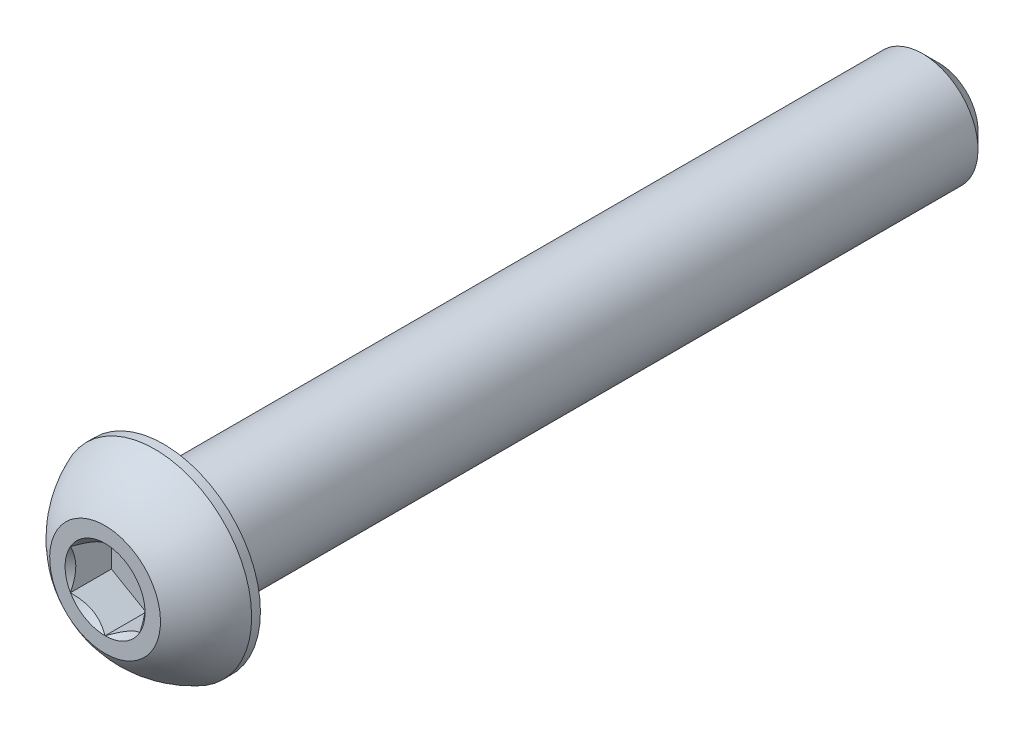
ISO-10303-21;
HEADER;
FILE_DESCRIPTION(('STEP AP214'),'2;1');
FILE_NAME('part.step','',(''),(''),'','','');
FILE_SCHEMA(('AUTOMOTIVE_DESIGN { 1 0 10303 214 1 1 1 1 }'));
ENDSEC;
DATA;
#1=APPLICATION_CONTEXT('core data for automotive mechanical design processes');
#2=APPLICATION_PROTOCOL_DEFINITION('international standard','automotive_design',2000,#1);
#3=PRODUCT_CONTEXT('',#1,'mechanical');
#4=PRODUCT('Part','Part','',(#3));
#5=PRODUCT_RELATED_PRODUCT_CATEGORY('part','',(#4));
#6=PRODUCT_DEFINITION_FORMATION('','',#4);
#7=PRODUCT_DEFINITION_CONTEXT('part definition',#1,'design');
#8=PRODUCT_DEFINITION('design','',#6,#7);
#9=PRODUCT_DEFINITION_SHAPE('','',#8);
#10=(LENGTH_UNIT() NAMED_UNIT(*) SI_UNIT(.MILLI.,.METRE.));
#11=(NAMED_UNIT(*) PLANE_ANGLE_UNIT() SI_UNIT($,.RADIAN.));
#12=(NAMED_UNIT(*) SI_UNIT($,.STERADIAN.) SOLID_ANGLE_UNIT());
#13=UNCERTAINTY_MEASURE_WITH_UNIT(LENGTH_MEASURE(1.E-05),#10,'distance_accuracy_value','');
#14=(GEOMETRIC_REPRESENTATION_CONTEXT(3) GLOBAL_UNCERTAINTY_ASSIGNED_CONTEXT((#13)) GLOBAL_UNIT_ASSIGNED_CONTEXT((#10,
#11,#12)) REPRESENTATION_CONTEXT('',''));
#15=CARTESIAN_POINT('',(0.,0.,0.));
#16=DIRECTION('',(0.,0.,1.));
#17=DIRECTION('',(1.,0.,0.));
#18=AXIS2_PLACEMENT_3D('',#15,#16,#17);
#19=CARTESIAN_POINT('',(-1.66533453693773E-13,-3.17499999999982,-47.8027999999999));
#20=DIRECTION('',(0.,0.,-1.));
#21=DIRECTION('',(0.,0.999999999999999,0.));
#22=AXIS2_PLACEMENT_3D('',#19,#20,#21);
#23=PLANE('',#22);
#24=CARTESIAN_POINT('',(-2.77555756156289E-13,2.22044604925031E-13,-47.8027999999999));
#25=DIRECTION('',(0.,0.,-1.));
#26=DIRECTION('',(0.,0.999999999999999,0.));
#27=AXIS2_PLACEMENT_3D('',#24,#25,#26);
#28=CIRCLE('',#27,2.22250000000001);
#29=CARTESIAN_POINT('',(-2.77575033270916E-13,2.22250000000023,-47.8027999999999));
#30=VERTEX_POINT('',#29);
#31=EDGE_CURVE('E180',#30,#30,#28,.T.);
#32=ORIENTED_EDGE('',*,*,#31,.T.);
#33=EDGE_LOOP('',(#32));
#34=FACE_BOUND('',#33,.T.);
#35=ADVANCED_FACE('F40',(#34),#23,.T.);
#36=CARTESIAN_POINT('',(-2.77555756156289E-13,2.22044604925031E-13,-47.8027999999999));
#37=DIRECTION('',(0.,0.,-1.));
#38=DIRECTION('',(0.,0.999999999999999,0.));
#39=AXIS2_PLACEMENT_3D('',#36,#37,#38);
#40=CYLINDRICAL_SURFACE('',#39,3.175);
#41=CARTESIAN_POINT('',(-2.77555756156289E-13,1.11022302462516E-13,-46.8503));
#42=DIRECTION('',(0.,0.,-1.));
#43=DIRECTION('',(0.,0.999999999999999,0.));
#44=AXIS2_PLACEMENT_3D('',#41,#42,#43);
#45=CIRCLE('',#44,3.175);
#46=CARTESIAN_POINT('',(-2.77581672713979E-13,3.17500000000022,-46.8503));
#47=VERTEX_POINT('',#46);
#48=EDGE_CURVE('E54',#47,#47,#45,.F.);
#49=CARTESIAN_POINT('',(-1.66533453693773E-13,1.11022302462516E-13,-3.35279999999999));
#50=DIRECTION('',(0.,0.,1.));
#51=DIRECTION('',(1.,0.,0.));
#52=AXIS2_PLACEMENT_3D('',#49,#50,#51);
#53=CIRCLE('',#52,3.175);
#54=CARTESIAN_POINT('',(-2.77507593275197E-13,3.17500000000022,-3.35279999999998));
#55=VERTEX_POINT('',#54);
#56=EDGE_CURVE('E177',#55,#55,#53,.F.);
#57=CARTESIAN_POINT('',(-2.77581672713979E-13,3.17500000000022,-46.8503));
#58=CARTESIAN_POINT('',(-2.77580901053158E-13,3.17500000000022,-46.3972010416666));
#59=CARTESIAN_POINT('',(-2.77580129392337E-13,3.17500000000022,-45.9441020833333));
#60=CARTESIAN_POINT('',(-2.77578586070696E-13,3.17500000000022,-45.0379041666666));
#61=CARTESIAN_POINT('',(-2.77577814409875E-13,3.17500000000022,-44.5848052083333));
#62=CARTESIAN_POINT('',(-2.77576271088234E-13,3.17500000000022,-43.6786072916666));
#63=CARTESIAN_POINT('',(-2.77575499427414E-13,3.17500000000022,-43.2255083333333));
#64=CARTESIAN_POINT('',(-2.77573956105772E-13,3.17500000000022,-42.3193104166666));
#65=CARTESIAN_POINT('',(-2.77573184444952E-13,3.17500000000022,-41.8662114583333));
#66=CARTESIAN_POINT('',(-2.7757164112331E-13,3.17500000000022,-40.9600135416666));
#67=CARTESIAN_POINT('',(-2.7757086946249E-13,3.17500000000022,-40.5069145833333));
#68=CARTESIAN_POINT('',(-2.77569326140848E-13,3.17500000000022,-39.6007166666666));
#69=CARTESIAN_POINT('',(-2.77568554480028E-13,3.17500000000022,-39.1476177083333));
#70=CARTESIAN_POINT('',(-2.77567011158386E-13,3.17500000000022,-38.2414197916666));
#71=CARTESIAN_POINT('',(-2.77566239497566E-13,3.17500000000022,-37.7883208333333));
#72=CARTESIAN_POINT('',(-2.77564696175925E-13,3.17500000000022,-36.8821229166666));
#73=CARTESIAN_POINT('',(-2.77563924515104E-13,3.17500000000022,-36.4290239583333));
#74=CARTESIAN_POINT('',(-2.77562381193463E-13,3.17500000000022,-35.5228260416666));
#75=CARTESIAN_POINT('',(-2.77561609532642E-13,3.17500000000022,-35.0697270833333));
#76=CARTESIAN_POINT('',(-2.77560066211001E-13,3.17500000000022,-34.1635291666666));
#77=CARTESIAN_POINT('',(-2.7755929455018E-13,3.17500000000022,-33.7104302083333));
#78=CARTESIAN_POINT('',(-2.77557751228539E-13,3.17500000000022,-32.8042322916666));
#79=CARTESIAN_POINT('',(-2.77556979567718E-13,3.17500000000022,-32.3511333333333));
#80=CARTESIAN_POINT('',(-2.77555436246077E-13,3.17500000000022,-31.4449354166666));
#81=CARTESIAN_POINT('',(-2.77554664585256E-13,3.17500000000022,-30.9918364583333));
#82=CARTESIAN_POINT('',(-2.77553121263615E-13,3.17500000000022,-30.0856385416666));
#83=CARTESIAN_POINT('',(-2.77552349602794E-13,3.17500000000022,-29.6325395833333));
#84=CARTESIAN_POINT('',(-2.77550806281153E-13,3.17500000000022,-28.7263416666666));
#85=CARTESIAN_POINT('',(-2.77550034620332E-13,3.17500000000022,-28.2732427083333));
#86=CARTESIAN_POINT('',(-2.77548491298691E-13,3.17500000000022,-27.3670447916666));
#87=CARTESIAN_POINT('',(-2.7754771963787E-13,3.17500000000022,-26.9139458333333));
#88=CARTESIAN_POINT('',(-2.77546176316229E-13,3.17500000000022,-26.0077479166666));
#89=CARTESIAN_POINT('',(-2.77545404655408E-13,3.17500000000022,-25.5546489583333));
#90=CARTESIAN_POINT('',(-2.77543861333767E-13,3.17500000000022,-24.6484510416666));
#91=CARTESIAN_POINT('',(-2.77543089672946E-13,3.17500000000022,-24.1953520833333));
#92=CARTESIAN_POINT('',(-2.77541546351305E-13,3.17500000000022,-23.2891541666666));
#93=CARTESIAN_POINT('',(-2.77540774690484E-13,3.17500000000022,-22.8360552083333));
#94=CARTESIAN_POINT('',(-2.77539231368843E-13,3.17500000000022,-21.9298572916666));
#95=CARTESIAN_POINT('',(-2.77538459708023E-13,3.17500000000022,-21.4767583333333));
#96=CARTESIAN_POINT('',(-2.77536916386381E-13,3.17500000000022,-20.5705604166666));
#97=CARTESIAN_POINT('',(-2.77536144725561E-13,3.17500000000022,-20.1174614583333));
#98=CARTESIAN_POINT('',(-2.77534601403919E-13,3.17500000000022,-19.2112635416666));
#99=CARTESIAN_POINT('',(-2.77533829743099E-13,3.17500000000022,-18.7581645833333));
#100=CARTESIAN_POINT('',(-2.77532286421457E-13,3.17500000000022,-17.8519666666666));
#101=CARTESIAN_POINT('',(-2.77531514760637E-13,3.17500000000022,-17.3988677083333));
#102=CARTESIAN_POINT('',(-2.77529971438995E-13,3.17500000000022,-16.4926697916666));
#103=CARTESIAN_POINT('',(-2.77529199778175E-13,3.17500000000022,-16.0395708333333));
#104=CARTESIAN_POINT('',(-2.77527656456533E-13,3.17500000000022,-15.1333729166666));
#105=CARTESIAN_POINT('',(-2.77526884795713E-13,3.17500000000022,-14.6802739583333));
#106=CARTESIAN_POINT('',(-2.77525341474071E-13,3.17500000000022,-13.7740760416666));
#107=CARTESIAN_POINT('',(-2.77524569813251E-13,3.17500000000022,-13.3209770833333));
#108=CARTESIAN_POINT('',(-2.7752302649161E-13,3.17500000000022,-12.4147791666666));
#109=CARTESIAN_POINT('',(-2.77522254830789E-13,3.17500000000022,-11.9616802083333));
#110=CARTESIAN_POINT('',(-2.77520711509148E-13,3.17500000000022,-11.0554822916666));
#111=CARTESIAN_POINT('',(-2.77519939848327E-13,3.17500000000022,-10.6023833333333));
#112=CARTESIAN_POINT('',(-2.77518396526686E-13,3.17500000000022,-9.69618541666664));
#113=CARTESIAN_POINT('',(-2.77517624865865E-13,3.17500000000022,-9.24308645833331));
#114=CARTESIAN_POINT('',(-2.77516081544224E-13,3.17500000000022,-8.33688854166664));
#115=CARTESIAN_POINT('',(-2.77515309883403E-13,3.17500000000022,-7.88378958333331));
#116=CARTESIAN_POINT('',(-2.77513766561762E-13,3.17500000000022,-6.97759166666665));
#117=CARTESIAN_POINT('',(-2.77512994900941E-13,3.17500000000022,-6.52449270833331));
#118=CARTESIAN_POINT('',(-2.775114515793E-13,3.17500000000022,-5.61829479166665));
#119=CARTESIAN_POINT('',(-2.77510679918479E-13,3.17500000000022,-5.16519583333332));
#120=CARTESIAN_POINT('',(-2.77509136596838E-13,3.17500000000022,-4.25899791666665));
#121=CARTESIAN_POINT('',(-2.77508364936017E-13,3.17500000000022,-3.80589895833331));
#122=CARTESIAN_POINT('',(-2.77507593275197E-13,3.17500000000022,-3.35279999999998));
#123=B_SPLINE_CURVE_WITH_KNOTS('',3,(#57,#58,#59,#60,#61,#62,#63,#64,#65,#66,#67,#68,#69,#70,
#71,#72,#73,#74,#75,#76,#77,#78,#79,#80,#81,#82,#83,#84,#85,#86,#87,#88,#89,#90,#91,#92,#93,#94,
#95,#96,#97,#98,#99,#100,#101,#102,#103,#104,#105,#106,#107,#108,#109,#110,#111,#112,#113,#114,
#115,#116,#117,#118,#119,#120,#121,#122),.UNSPECIFIED.,.F.,.F.,(4,2,2,2,2,2,2,2,2,2,2,2,2,2,2,2,
2,2,2,2,2,2,2,2,2,2,2,2,2,2,2,2,4),(0.,1.359296875,2.71859375,4.077890625,5.4371875,6.796484375,
8.15578124999999,9.51507812499999,10.874375,12.233671875,13.59296875,14.952265625,16.3115625,
17.670859375,19.03015625,20.389453125,21.74875,23.108046875,24.46734375,25.826640625,27.1859375,
28.545234375,29.90453125,31.263828125,32.623125,33.982421875,35.34171875,36.701015625,
38.0603125,39.419609375,40.77890625,42.138203125,43.4975),.UNSPECIFIED.);
#124=EDGE_CURVE('BSEAM185',#47,#55,#123,.T.);
#125=ORIENTED_EDGE('',*,*,#48,.T.);
#126=ORIENTED_EDGE('',*,*,#56,.T.);
#127=ORIENTED_EDGE('',*,*,#124,.T.);
#128=ORIENTED_EDGE('',*,*,#124,.F.);
#129=EDGE_LOOP('',(#125,#127,#126,#128));
#130=FACE_BOUND('',#129,.T.);
#131=ADVANCED_FACE('F185',(#130),#40,.T.);
#132=CARTESIAN_POINT('',(-2.77555756156289E-13,2.22044604925031E-13,-47.8027999999999));
#133=DIRECTION('',(0.,0.,1.));
#134=DIRECTION('',(0.,-0.999999999999999,0.));
#135=AXIS2_PLACEMENT_3D('',#132,#133,#134);
#136=CONICAL_SURFACE('',#135,2.22250000000001,0.785398163397447);
#137=ORIENTED_EDGE('',*,*,#48,.F.);
#138=EDGE_LOOP('',(#137));
#139=FACE_BOUND('',#138,.T.);
#140=ORIENTED_EDGE('',*,*,#31,.F.);
#141=EDGE_LOOP('',(#140));
#142=FACE_BOUND('',#141,.T.);
#143=ADVANCED_FACE('F42',(#139,#142),#136,.T.);
#144=CARTESIAN_POINT('',(0.,2.22044604925031E-13,-5.06031499999979));
#145=DIRECTION('',(0.,0.,1.));
#146=DIRECTION('',(0.,-0.999999999999999,0.));
#147=AXIS2_PLACEMENT_3D('',#144,#145,#146);
#148=SPHERICAL_SURFACE('',#147,5.97389428256184);
#149=CARTESIAN_POINT('',(0.,0.,0.));
#150=DIRECTION('',(0.,0.,1.));
#151=DIRECTION('',(1.,0.,0.));
#152=AXIS2_PLACEMENT_3D('',#149,#150,#151);
#153=CIRCLE('',#152,3.175);
#154=CARTESIAN_POINT('',(0.,-3.17500000000011,0.));
#155=VERTEX_POINT('',#154);
#156=EDGE_CURVE('E174',#155,#155,#153,.T.);
#157=CARTESIAN_POINT('',(-2.77555756156289E-13,1.11022302462516E-13,-2.84988));
#158=DIRECTION('',(0.,0.,1.));
#159=DIRECTION('',(1.,0.,0.));
#160=AXIS2_PLACEMENT_3D('',#157,#158,#159);
#161=CIRCLE('',#160,5.5499);
#162=CARTESIAN_POINT('',(0.,-5.54989999999986,-2.84988));
#163=VERTEX_POINT('',#162);
#164=EDGE_CURVE('E168',#163,#163,#161,.T.);
#165=CARTESIAN_POINT('',(0.,-3.17500000000011,0.));
#166=CARTESIAN_POINT('',(0.,-3.20828343957195,-0.0208830076580501));
#167=CARTESIAN_POINT('',(0.,-3.24136078860715,-0.0420944789280511));
#168=CARTESIAN_POINT('',(0.,-3.3070905577515,-0.0851658910984746));
#169=CARTESIAN_POINT('',(0.,-3.33974297786066,-0.107025831998897));
#170=CARTESIAN_POINT('',(0.,-3.40461014130017,-0.151385725836683));
#171=CARTESIAN_POINT('',(0.,-3.43682488463052,-0.173885678774046));
#172=CARTESIAN_POINT('',(0.,-3.50080416139469,-0.219516822259489));
#173=CARTESIAN_POINT('',(0.,-3.53256869482851,-0.242648012807569));
#174=CARTESIAN_POINT('',(0.,-3.59563518208841,-0.289532629449115));
#175=CARTESIAN_POINT('',(0.,-3.62693713591449,-0.313286055542582));
#176=CARTESIAN_POINT('',(0.,-3.68906627753113,-0.361405894091345));
#177=CARTESIAN_POINT('',(0.,-3.71989346532169,-0.385772306546641));
#178=CARTESIAN_POINT('',(0.,-3.7810610724321,-0.435108631276894));
#179=CARTESIAN_POINT('',(0.,-3.81140149175195,-0.46007854355185));
#180=CARTESIAN_POINT('',(0.,-3.87158374923264,-0.510612146063956));
#181=CARTESIAN_POINT('',(0.,-3.90142558739347,-0.536175836301106));
#182=CARTESIAN_POINT('',(0.,-3.96059906392417,-0.587887041792104));
#183=CARTESIAN_POINT('',(0.,-3.98993070229403,-0.614034557045953));
#184=CARTESIAN_POINT('',(0.,-4.04807235926835,-0.666903232293429));
#185=CARTESIAN_POINT('',(0.,-4.07688237787282,-0.693624392287057));
#186=CARTESIAN_POINT('',(0.,-4.13396957842493,-0.74762995340108));
#187=CARTESIAN_POINT('',(0.,-4.16224676037258,-0.774914354521477));
#188=CARTESIAN_POINT('',(0.,-4.21825727817543,-0.830035774981971));
#189=CARTESIAN_POINT('',(0.,-4.24599061403062,-0.857872794322069));
#190=CARTESIAN_POINT('',(0.,-4.30090264195358,-0.914088613159046));
#191=CARTESIAN_POINT('',(0.,-4.32808133402134,-0.942467412655924));
#192=CARTESIAN_POINT('',(0.,-4.38187349261952,-0.999755742806767));
#193=CARTESIAN_POINT('',(0.,-4.40848695914994,-1.02866527346073));
#194=CARTESIAN_POINT('',(0.,-4.46113830498837,-1.08700381029125));
#195=CARTESIAN_POINT('',(0.,-4.48717618429637,-1.11643281646781));
#196=CARTESIAN_POINT('',(0.,-4.538666218104,-1.17579884645646));
#197=CARTESIAN_POINT('',(0.,-4.56411837260362,-1.20573587026855));
#198=CARTESIAN_POINT('',(0.,-4.61442704725454,-1.26610627984967));
#199=CARTESIAN_POINT('',(0.,-4.63928356740584,-1.29653966561869));
#200=CARTESIAN_POINT('',(0.,-4.68839129572445,-1.35789095018152));
#201=CARTESIAN_POINT('',(0.,-4.71264250389174,-1.38880884897534));
#202=CARTESIAN_POINT('',(0.,-4.76053016627877,-1.45111712201536));
#203=CARTESIAN_POINT('',(0.,-4.78416662049849,-1.48250749626158));
#204=CARTESIAN_POINT('',(0.,-4.83081557237505,-1.54574849868044));
#205=CARTESIAN_POINT('',(0.,-4.85382807003188,-1.57759912685309));
#206=CARTESIAN_POINT('',(0.,-4.89922014909853,-1.64174823640365));
#207=CARTESIAN_POINT('',(0.,-4.92159973050835,-1.67404671778156));
#208=CARTESIAN_POINT('',(0.,-4.96571726381651,-1.73907895865429));
#209=CARTESIAN_POINT('',(0.,-4.98745521571486,-1.77181271814911));
#210=CARTESIAN_POINT('',(0.,-5.03028102654712,-1.83770277069634));
#211=CARTESIAN_POINT('',(0.,-5.05136888548103,-1.87085906374876));
#212=CARTESIAN_POINT('',(0.,-5.09288630004055,-1.93758127434191));
#213=CARTESIAN_POINT('',(0.,-5.11331585566616,-1.97114719188263));
#214=CARTESIAN_POINT('',(0.,-5.15350870956159,-2.03867558290301));
#215=CARTESIAN_POINT('',(0.,-5.17327200783142,-2.07263805638267));
#216=CARTESIAN_POINT('',(0.,-5.21212465239599,-2.14094633632488));
#217=CARTESIAN_POINT('',(0.,-5.23121399869072,-2.17529214278743));
#218=CARTESIAN_POINT('',(0.,-5.26871130697925,-2.24435371653591));
#219=CARTESIAN_POINT('',(0.,-5.28711926897304,-2.27906948382185));
#220=CARTESIAN_POINT('',(0.,-5.32324664200816,-2.34885746285521));
#221=CARTESIAN_POINT('',(0.,-5.34096605304949,-2.38392967460263));
#222=CARTESIAN_POINT('',(0.,-5.37570942417463,-2.45441688802314));
#223=CARTESIAN_POINT('',(0.,-5.39273338425844,-2.48983188969623));
#224=CARTESIAN_POINT('',(0.,-5.42607922958172,-2.56099089271575));
#225=CARTESIAN_POINT('',(0.,-5.44240111482119,-2.59673489406218));
#226=CARTESIAN_POINT('',(0.,-5.47433643994303,-2.66853798649801));
#227=CARTESIAN_POINT('',(0.,-5.4899498798254,-2.70459707758743));
#228=CARTESIAN_POINT('',(0.,-5.52046229408174,-2.77701628549785));
#229=CARTESIAN_POINT('',(0.,-5.53536126845572,-2.81337640231887));
#230=CARTESIAN_POINT('',(0.,-5.54989999999986,-2.84988));
#231=B_SPLINE_CURVE_WITH_KNOTS('',3,(#165,#166,#167,#168,#169,#170,#171,#172,#173,#174,#175,
#176,#177,#178,#179,#180,#181,#182,#183,#184,#185,#186,#187,#188,#189,#190,#191,#192,#193,#194,
#195,#196,#197,#198,#199,#200,#201,#202,#203,#204,#205,#206,#207,#208,#209,#210,#211,#212,#213,
#214,#215,#216,#217,#218,#219,#220,#221,#222,#223,#224,#225,#226,#227,#228,#229,#230),
.UNSPECIFIED.,.F.,.F.,(4,2,2,2,2,2,2,2,2,2,2,2,2,2,2,2,2,2,2,2,2,2,2,2,2,2,2,2,2,2,2,2,4),(0.,
0.117875080753694,0.235750161507388,0.353625242261083,0.471500323014778,0.589375403768472,
0.707250484522166,0.82512556527586,0.943000646029554,1.06087572678325,1.17875080753694,
1.29662588829064,1.41450096904433,1.53237604979803,1.65025113055172,1.76812621130541,
1.88600129205911,2.0038763728128,2.1217514535665,2.23962653432019,2.35750161507389,
2.47537669582758,2.59325177658127,2.71112685733497,2.82900193808866,2.94687701884236,
3.06475209959605,3.18262718034975,3.30050226110344,3.41837734185713,3.53625242261083,
3.65412750336452,3.77200258411822),.UNSPECIFIED.);
#232=EDGE_CURVE('BSEAM190',#155,#163,#231,.T.);
#233=ORIENTED_EDGE('',*,*,#156,.F.);
#234=ORIENTED_EDGE('',*,*,#164,.T.);
#235=ORIENTED_EDGE('',*,*,#232,.T.);
#236=ORIENTED_EDGE('',*,*,#232,.F.);
#237=EDGE_LOOP('',(#233,#235,#234,#236));
#238=FACE_BOUND('',#237,.T.);
#239=ADVANCED_FACE('F190',(#238),#148,.T.);
#240=CARTESIAN_POINT('',(0.,-3.17499999999959,0.));
#241=DIRECTION('',(0.,0.,-1.));
#242=DIRECTION('',(-1.,0.,0.));
#243=AXIS2_PLACEMENT_3D('',#240,#241,#242);
#244=PLANE('',#243);
#245=CARTESIAN_POINT('',(0.,0.,0.));
#246=DIRECTION('',(0.,0.,1.));
#247=DIRECTION('',(1.,0.,0.));
#248=AXIS2_PLACEMENT_3D('',#245,#246,#247);
#249=CIRCLE('',#248,2.29135888084633);
#250=CARTESIAN_POINT('',(-1.98437499999998,1.14567944042332,0.));
#251=VERTEX_POINT('',#250);
#252=CARTESIAN_POINT('',(-1.98437500000004,-1.14567944042288,0.));
#253=VERTEX_POINT('',#252);
#254=EDGE_CURVE('E67',#251,#253,#249,.T.);
#255=ORIENTED_EDGE('',*,*,#254,.F.);
#256=CARTESIAN_POINT('',(-2.22044604925031E-13,2.29135888084664,0.));
#257=VERTEX_POINT('',#256);
#258=EDGE_CURVE('E139',#257,#251,#249,.T.);
#259=ORIENTED_EDGE('',*,*,#258,.F.);
#260=CARTESIAN_POINT('',(1.98437500000009,1.14567944042343,2.16406753628107E-13));
#261=VERTEX_POINT('',#260);
#262=EDGE_CURVE('E136',#261,#257,#249,.T.);
#263=ORIENTED_EDGE('',*,*,#262,.F.);
#264=CARTESIAN_POINT('',(1.98437499999982,-1.14567944042276,0.));
#265=VERTEX_POINT('',#264);
#266=EDGE_CURVE('E107',#265,#261,#249,.T.);
#267=ORIENTED_EDGE('',*,*,#266,.F.);
#268=CARTESIAN_POINT('',(-1.66533453693773E-13,-2.29135888084642,1.38777878078145E-13));
#269=VERTEX_POINT('',#268);
#270=EDGE_CURVE('E99',#269,#265,#249,.T.);
#271=ORIENTED_EDGE('',*,*,#270,.F.);
#272=EDGE_CURVE('E60',#253,#269,#249,.T.);
#273=ORIENTED_EDGE('',*,*,#272,.F.);
#274=EDGE_LOOP('',(#255,#259,#263,#267,#271,#273));
#275=FACE_BOUND('',#274,.T.);
#276=ORIENTED_EDGE('',*,*,#156,.T.);
#277=EDGE_LOOP('',(#276));
#278=FACE_BOUND('',#277,.T.);
#279=ADVANCED_FACE('F133',(#275,#278),#244,.F.);
#280=CARTESIAN_POINT('',(1.66533453693773E-13,-5.54989999999955,-3.35279999999999));
#281=DIRECTION('',(0.,0.,1.));
#282=DIRECTION('',(1.,0.,0.));
#283=AXIS2_PLACEMENT_3D('',#280,#281,#282);
#284=PLANE('',#283);
#285=ORIENTED_EDGE('',*,*,#56,.F.);
#286=EDGE_LOOP('',(#285));
#287=FACE_BOUND('',#286,.T.);
#288=CARTESIAN_POINT('',(-1.66533453693773E-13,1.11022302462516E-13,-3.35279999999999));
#289=DIRECTION('',(0.,0.,1.));
#290=DIRECTION('',(1.,0.,0.));
#291=AXIS2_PLACEMENT_3D('',#288,#289,#290);
#292=CIRCLE('',#291,5.5499);
#293=CARTESIAN_POINT('',(5.54989999999985,1.10950095898871E-13,-3.35279999999999));
#294=VERTEX_POINT('',#293);
#295=EDGE_CURVE('E171',#294,#294,#292,.T.);
#296=ORIENTED_EDGE('',*,*,#295,.F.);
#297=EDGE_LOOP('',(#296));
#298=FACE_BOUND('',#297,.T.);
#299=ADVANCED_FACE('F204',(#287,#298),#284,.F.);
#300=CARTESIAN_POINT('',(0.,0.,0.));
#301=DIRECTION('',(0.,0.,1.));
#302=DIRECTION('',(1.,0.,0.));
#303=AXIS2_PLACEMENT_3D('',#300,#301,#302);
#304=CYLINDRICAL_SURFACE('',#303,5.5499);
#305=ORIENTED_EDGE('',*,*,#164,.F.);
#306=EDGE_LOOP('',(#305));
#307=FACE_BOUND('',#306,.T.);
#308=ORIENTED_EDGE('',*,*,#295,.T.);
#309=EDGE_LOOP('',(#308));
#310=FACE_BOUND('',#309,.T.);
#311=ADVANCED_FACE('F207',(#307,#310),#304,.T.);
#312=CARTESIAN_POINT('',(0.,0.,0.));
#313=DIRECTION('',(0.,0.,1.));
#314=DIRECTION('',(1.,0.,0.));
#315=AXIS2_PLACEMENT_3D('',#312,#313,#314);
#316=CONICAL_SURFACE('',#315,2.29135888084633,0.78539816339745);
#317=ORIENTED_EDGE('',*,*,#266,.T.);
#318=CARTESIAN_POINT('',(1.98437500000015,-2.28495242157783,0.734984078816719));
#319=CARTESIAN_POINT('',(1.98437500000015,-2.22931635455373,0.692986685550774));
#320=CARTESIAN_POINT('',(1.98437500000015,-2.17336876548365,0.651396054076293));
#321=CARTESIAN_POINT('',(1.98437500000015,-2.0607277025815,0.5692084614714));
#322=CARTESIAN_POINT('',(1.98437500000015,-2.00403404503413,0.528611752404982));
#323=CARTESIAN_POINT('',(1.98437500000015,-1.88936329173465,0.448303503174624));
#324=CARTESIAN_POINT('',(1.98437500000015,-1.83137965519324,0.408601258813258));
#325=CARTESIAN_POINT('',(1.98437500000015,-1.71442802137816,0.330685173401239));
#326=CARTESIAN_POINT('',(1.98437500000015,-1.65546009407202,0.292471227194315));
#327=CARTESIAN_POINT('',(1.98437500000016,-1.47005472306007,0.176252834013597));
#328=CARTESIAN_POINT('',(1.98437500000019,-1.34163909427853,0.101347886872374));
#329=CARTESIAN_POINT('',(1.98437500000011,-1.07840384705449,-0.0356697845603189));
#330=CARTESIAN_POINT('',(1.98437499999998,-0.943607781407151,-0.0978256335177627));
#331=CARTESIAN_POINT('',(1.98437500000007,-0.741275100444582,-0.173867421311422));
#332=CARTESIAN_POINT('',(1.98437500000013,-0.676735408880779,-0.195691938673973));
#333=CARTESIAN_POINT('',(1.98437500000017,-0.546098118112431,-0.234159536462133));
#334=CARTESIAN_POINT('',(1.98437500000014,-0.480000411919627,-0.250802259934391));
#335=CARTESIAN_POINT('',(1.98437500000016,-0.347746170028201,-0.277764619130181));
#336=CARTESIAN_POINT('',(1.98437500000021,-0.281612071478789,-0.288192590263966));
#337=CARTESIAN_POINT('',(1.98437500000009,-0.148636620052024,-0.302521852623321));
#338=CARTESIAN_POINT('',(1.98437499999992,-0.0817953907390088,-0.306424265772637));
#339=CARTESIAN_POINT('',(1.98437499999993,0.0495156750893439,-0.307412948667325));
#340=CARTESIAN_POINT('',(1.98437500000009,0.113983775103246,-0.304740821124861));
#341=CARTESIAN_POINT('',(1.9843750000002,0.242367515846393,-0.29326078950227));
#342=CARTESIAN_POINT('',(1.98437500000015,0.306283102296122,-0.284452289360601));
#343=CARTESIAN_POINT('',(1.98437500000015,0.434181040262353,-0.261030978666926));
#344=CARTESIAN_POINT('',(1.98437500000019,0.498145026858459,-0.246319393767714));
#345=CARTESIAN_POINT('',(1.98437500000011,0.624675616953136,-0.211873818587712));
#346=CARTESIAN_POINT('',(1.98437499999998,0.687242336899817,-0.192140248550706));
#347=CARTESIAN_POINT('',(1.98437499999981,0.884225483826214,-0.122587762769225));
#348=CARTESIAN_POINT('',(1.98437500000006,1.01583674256476,-0.0648475887433785));
#349=CARTESIAN_POINT('',(1.98437500000024,1.27288659242658,0.063530336589002));
#350=CARTESIAN_POINT('',(1.98437500000016,1.39830088270488,0.134214424919588));
#351=CARTESIAN_POINT('',(1.98437500000014,1.5795668799023,0.244516663813371));
#352=CARTESIAN_POINT('',(1.98437500000015,1.63738271299433,0.280969829475539));
#353=CARTESIAN_POINT('',(1.98437500000015,1.75202215386211,0.355415963291879));
#354=CARTESIAN_POINT('',(1.98437500000015,1.80884568601372,0.393409048078223));
#355=CARTESIAN_POINT('',(1.98437500000015,1.92116923084264,0.470338808893271));
#356=CARTESIAN_POINT('',(1.98437500000015,1.9766762451226,0.509265313038988));
#357=CARTESIAN_POINT('',(1.98437500000014,2.08693170717176,0.588147746121513));
#358=CARTESIAN_POINT('',(1.98437500000013,2.14168035934807,0.62810338902407));
#359=CARTESIAN_POINT('',(1.98437500000009,2.1961114904665,0.668480611285266));
#360=B_SPLINE_CURVE_WITH_KNOTS('',3,(#318,#319,#320,#321,#322,#323,#324,#325,#326,#327,#328,
#329,#330,#331,#332,#333,#334,#335,#336,#337,#338,#339,#340,#341,#342,#343,#344,#345,#346,#347,
#348,#349,#350,#351,#352,#353,#354,#355,#356,#357,#358,#359),.UNSPECIFIED.,.F.,.F.,(4,2,2,2,2,2,
2,2,2,2,2,2,2,2,2,2,2,2,2,2,4),(0.,0.209126070008316,0.418304637356558,0.629103979977996,
0.839888401371204,1.28549951116132,1.72957750768357,1.93379389749976,2.13802435186702,
2.33858179514338,2.53910475350641,2.7323696340079,2.92565329006878,3.12231577097474,
3.31896180041326,3.74886295245152,4.18033428125345,4.38536017180273,4.59040161996366,
4.79377749165089,4.99709743524109),.UNSPECIFIED.);
#361=EDGE_CURVE('E11',#265,#261,#360,.T.);
#362=ORIENTED_EDGE('',*,*,#361,.F.);
#363=EDGE_LOOP('',(#317,#362));
#364=FACE_BOUND('',#363,.T.);
#365=ADVANCED_FACE('F111',(#364),#316,.F.);
#366=ORIENTED_EDGE('',*,*,#262,.T.);
#367=CARTESIAN_POINT('',(1.98457499999999,1.14556397036969,0.000115478781920111));
#368=CARTESIAN_POINT('',(1.9163590048331,1.18494849354207,-0.0392371477361143));
#369=CARTESIAN_POINT('',(1.8470023148929,1.22499159714906,-0.0762786895538868));
#370=CARTESIAN_POINT('',(1.70557619954765,1.30664400291403,-0.144101141576774));
#371=CARTESIAN_POINT('',(1.63349332126306,1.34826107209564,-0.174844310908328));
#372=CARTESIAN_POINT('',(1.48814160273383,1.43217992591564,-0.22750811118885));
#373=CARTESIAN_POINT('',(1.41490978751289,1.47446033414663,-0.249561124120098));
#374=CARTESIAN_POINT('',(1.26683381740521,1.55995203534895,-0.28353850705615));
#375=CARTESIAN_POINT('',(1.19199418724659,1.60316071596728,-0.295488243908262));
#376=CARTESIAN_POINT('',(1.06301458545616,1.67762712378089,-0.306269900918088));
#377=CARTESIAN_POINT('',(1.00904128422746,1.70878862377419,-0.307866100940944));
#378=CARTESIAN_POINT('',(0.901182881480037,1.77106070163468,-0.305178161134722));
#379=CARTESIAN_POINT('',(0.847297817514326,1.80217125782063,-0.300891959659536));
#380=CARTESIAN_POINT('',(0.740036461751217,1.86409863044411,-0.286683126986478));
#381=CARTESIAN_POINT('',(0.686660807239642,1.8949150789445,-0.276754189547746));
#382=CARTESIAN_POINT('',(0.5808324825909,1.95601509066841,-0.25180491572538));
#383=CARTESIAN_POINT('',(0.528379742028748,1.98629869455181,-0.236784969610309));
#384=CARTESIAN_POINT('',(0.39401766103621,2.06387267818181,-0.192192148364033));
#385=CARTESIAN_POINT('',(0.312941642841407,2.11068193911126,-0.159257004061528));
#386=CARTESIAN_POINT('',(0.193726693269814,2.17951072233772,-0.103657558797677));
#387=CARTESIAN_POINT('',(0.154440075613648,2.20219286161703,-0.0841224079479804));
#388=CARTESIAN_POINT('',(0.0765946381316411,2.24713694590259,-0.0432712618804476));
#389=CARTESIAN_POINT('',(0.0380353888980434,2.26939913882753,-0.0219563604315353));
#390=CARTESIAN_POINT('',(-0.000200000000172285,2.29147435090082,0.000115478781814726));
#391=B_SPLINE_CURVE_WITH_KNOTS('',3,(#367,#368,#369,#370,#371,#372,#373,#374,#375,#376,#377,
#378,#379,#380,#381,#382,#383,#384,#385,#386,#387,#388,#389,#390),.UNSPECIFIED.,.F.,.F.,(4,2,2,
2,2,2,2,2,2,2,2,4),(0.,0.264339630306673,0.530219665093756,0.79187641637146,1.05287424418105,
1.239639843932,1.42647091743856,1.61351120244044,1.80053715247557,2.0976420996434,
2.24579179873739,2.39385111134184),.UNSPECIFIED.);
#392=EDGE_CURVE('E138',#261,#257,#391,.T.);
#393=ORIENTED_EDGE('',*,*,#392,.F.);
#394=EDGE_LOOP('',(#366,#393));
#395=FACE_BOUND('',#394,.T.);
#396=ADVANCED_FACE('F292',(#395),#316,.F.);
#397=ORIENTED_EDGE('',*,*,#258,.T.);
#398=CARTESIAN_POINT('',(0.000200000000227796,2.29147435090049,0.00011547878173146));
#399=CARTESIAN_POINT('',(-0.0680159951666552,2.2520898277278,-0.0392371477360094));
#400=CARTESIAN_POINT('',(-0.137372685106869,2.2120467241207,-0.0762786895536781));
#401=CARTESIAN_POINT('',(-0.278798800452173,2.13039431835564,-0.144101141576522));
#402=CARTESIAN_POINT('',(-0.350881678736801,2.08877724917405,-0.174844310908134));
#403=CARTESIAN_POINT('',(-0.496233397266083,2.00485839535399,-0.2275081111887));
#404=CARTESIAN_POINT('',(-0.569465212487046,1.9625779871229,-0.249561124119934));
#405=CARTESIAN_POINT('',(-0.717541182594891,1.87708628592067,-0.283538507056068));
#406=CARTESIAN_POINT('',(-0.79238081275366,1.83387760530252,-0.295488243908276));
#407=CARTESIAN_POINT('',(-0.921360414544026,1.75941119748885,-0.306269900918061));
#408=CARTESIAN_POINT('',(-0.975333715772592,1.72824969749544,-0.307866100940844));
#409=CARTESIAN_POINT('',(-1.08319211851986,1.66597761963491,-0.305178161134586));
#410=CARTESIAN_POINT('',(-1.13707718248555,1.63486706344903,-0.300891959659437));
#411=CARTESIAN_POINT('',(-1.24433853824856,1.57293969082562,-0.286683126986398));
#412=CARTESIAN_POINT('',(-1.29771419276005,1.54212324232522,-0.276754189547646));
#413=CARTESIAN_POINT('',(-1.40354251740875,1.48102323060143,-0.251804915725423));
#414=CARTESIAN_POINT('',(-1.45599525797093,1.45073962671815,-0.236784969610513));
#415=CARTESIAN_POINT('',(-1.5903573389635,1.37316564308823,-0.192192148364375));
#416=CARTESIAN_POINT('',(-1.67143335715818,1.32635638215865,-0.159257004061685));
#417=CARTESIAN_POINT('',(-1.79064830672974,1.25752759893208,-0.103657558797772));
#418=CARTESIAN_POINT('',(-1.82993492438592,1.23484545965275,-0.084122407948088));
#419=CARTESIAN_POINT('',(-1.90778036186801,1.18990137536725,-0.0432712618805835));
#420=CARTESIAN_POINT('',(-1.94633961110168,1.16763918244239,-0.0219563604316873));
#421=CARTESIAN_POINT('',(-1.98457499999999,1.14556397036925,0.00011547878168202));
#422=B_SPLINE_CURVE_WITH_KNOTS('',3,(#398,#399,#400,#401,#402,#403,#404,#405,#406,#407,#408,
#409,#410,#411,#412,#413,#414,#415,#416,#417,#418,#419,#420,#421),.UNSPECIFIED.,.F.,.F.,(4,2,2,
2,2,2,2,2,2,2,2,4),(0.,0.264339630306727,0.530219665093935,0.791876416371814,1.05287424418154,
1.23963984393231,1.4264709174387,1.6135112024404,1.80053715247532,2.09764209964321,
2.24579179873725,2.39385111134174),.UNSPECIFIED.);
#423=EDGE_CURVE('E143',#257,#251,#422,.T.);
#424=ORIENTED_EDGE('',*,*,#423,.F.);
#425=EDGE_LOOP('',(#397,#424));
#426=FACE_BOUND('',#425,.T.);
#427=ADVANCED_FACE('F146',(#426),#316,.F.);
#428=ORIENTED_EDGE('',*,*,#254,.T.);
#429=CARTESIAN_POINT('',(-1.98437500000004,-2.28495242157811,0.734984078816481));
#430=CARTESIAN_POINT('',(-1.98437499999993,-2.22931635455392,0.692986685550634));
#431=CARTESIAN_POINT('',(-1.98437499999989,-2.1733687654838,0.651396054076187));
#432=CARTESIAN_POINT('',(-1.98437499999986,-2.0607277025816,0.569208461471306));
#433=CARTESIAN_POINT('',(-1.98437499999987,-2.00403404503423,0.528611752404866));
#434=CARTESIAN_POINT('',(-1.98437499999988,-1.88936329173475,0.448303503174482));
#435=CARTESIAN_POINT('',(-1.98437499999987,-1.83137965519333,0.408601258813113));
#436=CARTESIAN_POINT('',(-1.98437499999987,-1.71442802137823,0.330685173401083));
#437=CARTESIAN_POINT('',(-1.98437499999988,-1.6554600940721,0.292471227194153));
#438=CARTESIAN_POINT('',(-1.98437499999986,-1.47005472306017,0.176252834013428));
#439=CARTESIAN_POINT('',(-1.98437499999981,-1.34163909427865,0.101347886872197));
#440=CARTESIAN_POINT('',(-1.98437499999994,-1.07840384705464,-0.0356697845604729));
#441=CARTESIAN_POINT('',(-1.98437500000013,-0.943607781407299,-0.0978256335178843));
#442=CARTESIAN_POINT('',(-1.984375,-0.741275100444744,-0.173867421311597));
#443=CARTESIAN_POINT('',(-1.9843749999999,-0.676735408880941,-0.195691938674181));
#444=CARTESIAN_POINT('',(-1.98437499999984,-0.546098118112589,-0.23415953646236));
#445=CARTESIAN_POINT('',(-1.98437499999988,-0.480000411919781,-0.250802259934604));
#446=CARTESIAN_POINT('',(-1.98437499999986,-0.347746170028347,-0.277764619130449));
#447=CARTESIAN_POINT('',(-1.9843749999998,-0.281612071478929,-0.2881925902643));
#448=CARTESIAN_POINT('',(-1.98437499999994,-0.148636620052131,-0.302521852623512));
#449=CARTESIAN_POINT('',(-1.98437500000015,-0.0817953907390896,-0.306424265772618));
#450=CARTESIAN_POINT('',(-1.98437500000015,0.0495156750893194,-0.30741294866732));
#451=CARTESIAN_POINT('',(-1.98437499999994,0.113983775103252,-0.304740821125063));
#452=CARTESIAN_POINT('',(-1.9843749999998,0.242367515846441,-0.293260789502615));
#453=CARTESIAN_POINT('',(-1.98437499999985,0.306283102296182,-0.284452289360881));
#454=CARTESIAN_POINT('',(-1.98437499999989,0.434181040262439,-0.261030978667165));
#455=CARTESIAN_POINT('',(-1.98437499999987,0.498145026858558,-0.246319393767977));
#456=CARTESIAN_POINT('',(-1.98437499999988,0.624675616953245,-0.211873818587925));
#457=CARTESIAN_POINT('',(-1.98437499999991,0.687242336899921,-0.192140248550844));
#458=CARTESIAN_POINT('',(-1.98437499999996,0.884225483826294,-0.122587762769256));
#459=CARTESIAN_POINT('',(-1.98437499999989,1.01583674256487,-0.064847588743525));
#460=CARTESIAN_POINT('',(-1.98437499999985,1.27288659242667,0.0635303365887693));
#461=CARTESIAN_POINT('',(-1.98437499999987,1.39830088270493,0.134214424919383));
#462=CARTESIAN_POINT('',(-1.98437499999987,1.57956687990232,0.244516663813168));
#463=CARTESIAN_POINT('',(-1.98437499999987,1.63738271299435,0.280969829475337));
#464=CARTESIAN_POINT('',(-1.98437499999987,1.75202215386213,0.355415963291686));
#465=CARTESIAN_POINT('',(-1.98437499999987,1.80884568601373,0.393409048078038));
#466=CARTESIAN_POINT('',(-1.98437499999987,1.92116923084268,0.470338808893085));
#467=CARTESIAN_POINT('',(-1.98437499999987,1.97667624512266,0.509265313038794));
#468=CARTESIAN_POINT('',(-1.98437499999987,2.0869317071718,0.588147746121394));
#469=CARTESIAN_POINT('',(-1.98437499999987,2.14168035934808,0.628103389024034));
#470=CARTESIAN_POINT('',(-1.98437499999987,2.19611149046639,0.668480611285416));
#471=B_SPLINE_CURVE_WITH_KNOTS('',3,(#429,#430,#431,#432,#433,#434,#435,#436,#437,#438,#439,
#440,#441,#442,#443,#444,#445,#446,#447,#448,#449,#450,#451,#452,#453,#454,#455,#456,#457,#458,
#459,#460,#461,#462,#463,#464,#465,#466,#467,#468,#469,#470),.UNSPECIFIED.,.F.,.F.,(4,2,2,2,2,2,
2,2,2,2,2,2,2,2,2,2,2,2,2,2,4),(0.,0.209126070008357,0.41830463735664,0.629103979978099,
0.839888401371326,1.28549951116138,1.7295775076836,1.93379389749982,2.1380243518671,
2.33858179514348,2.53910475350657,2.73236963400813,2.92565329006905,3.12231577097505,
3.31896180041362,3.74886295245184,4.18033428125368,4.38536017180297,4.59040161996391,
4.79377749165118,4.99709743524143),.UNSPECIFIED.);
#472=EDGE_CURVE('E150',#251,#253,#471,.F.);
#473=ORIENTED_EDGE('',*,*,#472,.F.);
#474=EDGE_LOOP('',(#428,#473));
#475=FACE_BOUND('',#474,.T.);
#476=ADVANCED_FACE('F286',(#475),#316,.F.);
#477=ORIENTED_EDGE('',*,*,#272,.T.);
#478=CARTESIAN_POINT('',(-1.9845750000001,-1.14556397036936,0.000115478781904065));
#479=CARTESIAN_POINT('',(-1.91635900483321,-1.18494849354164,-0.0392371477362568));
#480=CARTESIAN_POINT('',(-1.84700231489301,-1.22499159714858,-0.0762786895540627));
#481=CARTESIAN_POINT('',(-1.7055761995478,-1.30664400291351,-0.144101141576961));
#482=CARTESIAN_POINT('',(-1.63349332126324,-1.34826107209511,-0.174844310908494));
#483=CARTESIAN_POINT('',(-1.48814160273405,-1.43217992591509,-0.227508111189097));
#484=CARTESIAN_POINT('',(-1.41490978751311,-1.47446033414608,-0.249561124120442));
#485=CARTESIAN_POINT('',(-1.26683381740539,-1.55995203534844,-0.283538507056347));
#486=CARTESIAN_POINT('',(-1.19199418724673,-1.60316071596682,-0.295488243908215));
#487=CARTESIAN_POINT('',(-1.06301458545625,-1.67762712378045,-0.306269900918164));
#488=CARTESIAN_POINT('',(-1.00904128422752,-1.70878862377374,-0.307866100941233));
#489=CARTESIAN_POINT('',(-0.901182881480068,-1.77106070163423,-0.305178161135171));
#490=CARTESIAN_POINT('',(-0.84729781751435,-1.8021712578202,-0.300891959659935));
#491=CARTESIAN_POINT('',(-0.740036461751216,-1.86409863044368,-0.286683126986852));
#492=CARTESIAN_POINT('',(-0.686660807239622,-1.89491507894405,-0.276754189548147));
#493=CARTESIAN_POINT('',(-0.580832482590906,-1.95601509066802,-0.251804915725774));
#494=CARTESIAN_POINT('',(-0.528379742028799,-1.98629869455151,-0.236784969610667));
#495=CARTESIAN_POINT('',(-0.394017661036308,-2.06387267818155,-0.192192148364364));
#496=CARTESIAN_POINT('',(-0.312941642841444,-2.11068193911085,-0.1592570040619));
#497=CARTESIAN_POINT('',(-0.193726693269832,-2.17951072233728,-0.103657558798134));
#498=CARTESIAN_POINT('',(-0.154440075613671,-2.20219286161661,-0.0841224079484678));
#499=CARTESIAN_POINT('',(-0.0765946381317049,-2.24713694590213,-0.0432712618808437));
#500=CARTESIAN_POINT('',(-0.038035388898145,-2.26939913882701,-0.0219563604318097));
#501=CARTESIAN_POINT('',(0.000200000000005751,-2.29147435090016,0.000115478781814726));
#502=B_SPLINE_CURVE_WITH_KNOTS('',3,(#478,#479,#480,#481,#482,#483,#484,#485,#486,#487,#488,
#489,#490,#491,#492,#493,#494,#495,#496,#497,#498,#499,#500,#501),.UNSPECIFIED.,.F.,.F.,(4,2,2,
2,2,2,2,2,2,2,2,4),(0.,0.26433963030667,0.530219665093645,0.791876416371386,1.05287424418106,
1.23963984393209,1.42647091743869,1.61351120244058,1.80053715247574,2.09764209964349,
2.24579179873745,2.3938511113419),.UNSPECIFIED.);
#503=EDGE_CURVE('E123',#253,#269,#502,.T.);
#504=ORIENTED_EDGE('',*,*,#503,.F.);
#505=EDGE_LOOP('',(#477,#504));
#506=FACE_BOUND('',#505,.T.);
#507=ADVANCED_FACE('F234',(#506),#316,.F.);
#508=ORIENTED_EDGE('',*,*,#270,.T.);
#509=CARTESIAN_POINT('',(-0.000200000000172285,-2.2914743508996,0.000115478781842482));
#510=CARTESIAN_POINT('',(0.0680159951666898,-2.25208982772721,-0.0392371477362662));
#511=CARTESIAN_POINT('',(0.137372685106894,-2.21204672412024,-0.0762786895540516));
#512=CARTESIAN_POINT('',(0.278798800452136,-2.13039431835531,-0.14410114157693));
#513=CARTESIAN_POINT('',(0.35088167873671,-2.08877724917373,-0.174844310908463));
#514=CARTESIAN_POINT('',(0.496233397265874,-2.0048583953537,-0.227508111189037));
#515=CARTESIAN_POINT('',(0.569465212486773,-1.96257798712265,-0.249561124120355));
#516=CARTESIAN_POINT('',(0.717541182594568,-1.87708628592047,-0.28353850705626));
#517=CARTESIAN_POINT('',(0.79238081275335,-1.83387760530234,-0.295488243908155));
#518=CARTESIAN_POINT('',(0.921360414543746,-1.75941119748865,-0.306269900918073));
#519=CARTESIAN_POINT('',(0.975333715772346,-1.7282496974952,-0.307866100941107));
#520=CARTESIAN_POINT('',(1.08319211851968,-1.6659776196346,-0.305178161135011));
#521=CARTESIAN_POINT('',(1.1370771824854,-1.63486706344871,-0.300891959659776));
#522=CARTESIAN_POINT('',(1.24433853824851,-1.57293969082526,-0.28668312698672));
#523=CARTESIAN_POINT('',(1.29771419276006,-1.54212324232486,-0.276754189548038));
#524=CARTESIAN_POINT('',(1.40354251740877,-1.48102323060098,-0.251804915725614));
#525=CARTESIAN_POINT('',(1.45599525797091,-1.45073962671763,-0.236784969610433));
#526=CARTESIAN_POINT('',(1.59035733896345,-1.37316564308766,-0.192192148364086));
#527=CARTESIAN_POINT('',(1.67143335715829,-1.32635638215816,-0.159257004061745));
#528=CARTESIAN_POINT('',(1.79064830672989,-1.25752759893161,-0.103657558797994));
#529=CARTESIAN_POINT('',(1.82993492438605,-1.23484545965227,-0.0841224079483066));
#530=CARTESIAN_POINT('',(1.9077803618681,-1.18990137536681,-0.0432712618806819));
#531=CARTESIAN_POINT('',(1.94633961110174,-1.16763918244201,-0.0219563604316684));
#532=CARTESIAN_POINT('',(1.98457500000004,-1.14556397036902,0.0001154787818646));
#533=B_SPLINE_CURVE_WITH_KNOTS('',3,(#509,#510,#511,#512,#513,#514,#515,#516,#517,#518,#519,
#520,#521,#522,#523,#524,#525,#526,#527,#528,#529,#530,#531,#532),.UNSPECIFIED.,.F.,.F.,(4,2,2,
2,2,2,2,2,2,2,2,4),(0.,0.26433963030669,0.530219665093689,0.791876416371386,1.05287424418102,
1.23963984393196,1.42647091743848,1.6135112024403,1.8005371524754,2.09764209964327,
2.24579179873726,2.39385111134176),.UNSPECIFIED.);
#534=EDGE_CURVE('E103',#269,#265,#533,.T.);
#535=ORIENTED_EDGE('',*,*,#534,.F.);
#536=EDGE_LOOP('',(#508,#535));
#537=FACE_BOUND('',#536,.T.);
#538=ADVANCED_FACE('F101',(#537),#316,.F.);
#539=CARTESIAN_POINT('',(1.98437500000015,-1.1456794404231,-2.3469600000001));
#540=DIRECTION('',(0.,0.,1.));
#541=DIRECTION('',(1.,0.,0.));
#542=AXIS2_PLACEMENT_3D('',#539,#540,#541);
#543=PLANE('',#542);
#544=DIRECTION('',(0.866025403784441,0.5,0.));
#545=VECTOR('',#544,1.);
#546=CARTESIAN_POINT('',(0.,-2.29135888084608,-2.34696000000004));
#547=LINE('',#546,#545);
#548=CARTESIAN_POINT('',(0.,-2.29135888084608,-2.34696000000004));
#549=VERTEX_POINT('',#548);
#550=CARTESIAN_POINT('',(1.98437500000015,-1.1456794404231,-2.3469600000001));
#551=VERTEX_POINT('',#550);
#552=EDGE_CURVE('E122',#549,#551,#547,.T.);
#553=ORIENTED_EDGE('',*,*,#552,.T.);
#554=DIRECTION('',(0.,0.999999999999999,0.));
#555=VECTOR('',#554,1.);
#556=CARTESIAN_POINT('',(1.98437500000015,-1.1456794404231,-2.3469600000001));
#557=LINE('',#556,#555);
#558=CARTESIAN_POINT('',(1.98437499999998,1.14567944042315,-2.34695999999996));
#559=VERTEX_POINT('',#558);
#560=EDGE_CURVE('E127',#551,#559,#557,.T.);
#561=ORIENTED_EDGE('',*,*,#560,.T.);
#562=DIRECTION('',(-0.86602540378444,0.5,0.));
#563=VECTOR('',#562,1.);
#564=CARTESIAN_POINT('',(1.98437499999998,1.14567944042315,-2.34695999999996));
#565=LINE('',#564,#563);
#566=CARTESIAN_POINT('',(0.,2.29135888084642,-2.34695999999995));
#567=VERTEX_POINT('',#566);
#568=EDGE_CURVE('E276',#559,#567,#565,.T.);
#569=ORIENTED_EDGE('',*,*,#568,.T.);
#570=DIRECTION('',(-0.866025403784441,-0.5,0.));
#571=VECTOR('',#570,1.);
#572=CARTESIAN_POINT('',(0.,2.29135888084642,-2.34695999999995));
#573=LINE('',#572,#571);
#574=CARTESIAN_POINT('',(-1.98437499999987,1.14567944042332,-2.34695999999986));
#575=VERTEX_POINT('',#574);
#576=EDGE_CURVE('E159',#567,#575,#573,.T.);
#577=ORIENTED_EDGE('',*,*,#576,.T.);
#578=DIRECTION('',(0.,-0.999999999999999,0.));
#579=VECTOR('',#578,1.);
#580=CARTESIAN_POINT('',(-1.98437499999987,1.14567944042332,-2.34695999999986));
#581=LINE('',#580,#579);
#582=CARTESIAN_POINT('',(-1.98437499999993,-1.14567944042276,-2.34695999999995));
#583=VERTEX_POINT('',#582);
#584=EDGE_CURVE('E280',#575,#583,#581,.T.);
#585=ORIENTED_EDGE('',*,*,#584,.T.);
#586=DIRECTION('',(0.86602540378444,-0.5,0.));
#587=VECTOR('',#586,1.);
#588=CARTESIAN_POINT('',(-1.98437499999993,-1.14567944042276,-2.34695999999995));
#589=LINE('',#588,#587);
#590=EDGE_CURVE('E130',#583,#549,#589,.T.);
#591=ORIENTED_EDGE('',*,*,#590,.T.);
#592=EDGE_LOOP('',(#553,#561,#569,#577,#585,#591));
#593=FACE_BOUND('',#592,.T.);
#594=ADVANCED_FACE('F233',(#593),#543,.T.);
#595=CARTESIAN_POINT('',(1.98437500000015,-1.1456794404231,-2.3469600000001));
#596=DIRECTION('',(1.,0.,0.));
#597=DIRECTION('',(0.,0.,-1.));
#598=AXIS2_PLACEMENT_3D('',#595,#596,#597);
#599=PLANE('',#598);
#600=DIRECTION('',(0.,0.,1.));
#601=VECTOR('',#600,1.);
#602=CARTESIAN_POINT('',(1.98437500000015,-1.1456794404231,-2.3469600000001));
#603=LINE('',#602,#601);
#604=EDGE_CURVE('E119',#551,#265,#603,.T.);
#605=ORIENTED_EDGE('',*,*,#604,.T.);
#606=ORIENTED_EDGE('',*,*,#361,.T.);
#607=DIRECTION('',(0.,0.,1.));
#608=VECTOR('',#607,1.);
#609=CARTESIAN_POINT('',(1.98437499999998,1.14567944042315,-2.34695999999996));
#610=LINE('',#609,#608);
#611=EDGE_CURVE('E129',#559,#261,#610,.T.);
#612=ORIENTED_EDGE('',*,*,#611,.F.);
#613=ORIENTED_EDGE('',*,*,#560,.F.);
#614=EDGE_LOOP('',(#605,#606,#612,#613));
#615=FACE_BOUND('',#614,.T.);
#616=ADVANCED_FACE('F125',(#615),#599,.F.);
#617=CARTESIAN_POINT('',(1.98437499999998,1.14567944042315,-2.34695999999996));
#618=DIRECTION('',(0.500000000000001,0.866025403784438,0.));
#619=DIRECTION('',(-0.86602540378444,0.5,0.));
#620=AXIS2_PLACEMENT_3D('',#617,#618,#619);
#621=PLANE('',#620);
#622=ORIENTED_EDGE('',*,*,#611,.T.);
#623=ORIENTED_EDGE('',*,*,#392,.T.);
#624=DIRECTION('',(0.,0.,1.));
#625=VECTOR('',#624,1.);
#626=CARTESIAN_POINT('',(0.,2.29135888084642,-2.34695999999995));
#627=LINE('',#626,#625);
#628=EDGE_CURVE('E155',#567,#257,#627,.T.);
#629=ORIENTED_EDGE('',*,*,#628,.F.);
#630=ORIENTED_EDGE('',*,*,#568,.F.);
#631=EDGE_LOOP('',(#622,#623,#629,#630));
#632=FACE_BOUND('',#631,.T.);
#633=ADVANCED_FACE('F153',(#632),#621,.F.);
#634=CARTESIAN_POINT('',(0.,2.29135888084642,-2.34695999999995));
#635=DIRECTION('',(-0.500000000000002,0.866025403784438,0.));
#636=DIRECTION('',(-0.866025403784441,-0.5,0.));
#637=AXIS2_PLACEMENT_3D('',#634,#635,#636);
#638=PLANE('',#637);
#639=ORIENTED_EDGE('',*,*,#628,.T.);
#640=ORIENTED_EDGE('',*,*,#423,.T.);
#641=DIRECTION('',(0.,0.,1.));
#642=VECTOR('',#641,1.);
#643=CARTESIAN_POINT('',(-1.98437499999987,1.14567944042332,-2.34695999999986));
#644=LINE('',#643,#642);
#645=EDGE_CURVE('E161',#575,#251,#644,.T.);
#646=ORIENTED_EDGE('',*,*,#645,.F.);
#647=ORIENTED_EDGE('',*,*,#576,.F.);
#648=EDGE_LOOP('',(#639,#640,#646,#647));
#649=FACE_BOUND('',#648,.T.);
#650=ADVANCED_FACE('F157',(#649),#638,.F.);
#651=CARTESIAN_POINT('',(-1.98437499999987,1.14567944042332,-2.34695999999986));
#652=DIRECTION('',(-1.,0.,0.));
#653=DIRECTION('',(0.,0.,1.));
#654=AXIS2_PLACEMENT_3D('',#651,#652,#653);
#655=PLANE('',#654);
#656=ORIENTED_EDGE('',*,*,#645,.T.);
#657=ORIENTED_EDGE('',*,*,#472,.T.);
#658=DIRECTION('',(0.,0.,1.));
#659=VECTOR('',#658,1.);
#660=CARTESIAN_POINT('',(-1.98437499999993,-1.14567944042276,-2.34695999999995));
#661=LINE('',#660,#659);
#662=EDGE_CURVE('E163',#583,#253,#661,.T.);
#663=ORIENTED_EDGE('',*,*,#662,.F.);
#664=ORIENTED_EDGE('',*,*,#584,.F.);
#665=EDGE_LOOP('',(#656,#657,#663,#664));
#666=FACE_BOUND('',#665,.T.);
#667=ADVANCED_FACE('F255',(#666),#655,.F.);
#668=CARTESIAN_POINT('',(-1.98437499999993,-1.14567944042276,-2.34695999999995));
#669=DIRECTION('',(-0.500000000000001,-0.866025403784438,0.));
#670=DIRECTION('',(0.86602540378444,-0.5,0.));
#671=AXIS2_PLACEMENT_3D('',#668,#669,#670);
#672=PLANE('',#671);
#673=ORIENTED_EDGE('',*,*,#662,.T.);
#674=ORIENTED_EDGE('',*,*,#503,.T.);
#675=DIRECTION('',(0.,0.,1.));
#676=VECTOR('',#675,1.);
#677=CARTESIAN_POINT('',(0.,-2.29135888084608,-2.34696000000004));
#678=LINE('',#677,#676);
#679=EDGE_CURVE('E121',#549,#269,#678,.T.);
#680=ORIENTED_EDGE('',*,*,#679,.F.);
#681=ORIENTED_EDGE('',*,*,#590,.F.);
#682=EDGE_LOOP('',(#673,#674,#680,#681));
#683=FACE_BOUND('',#682,.T.);
#684=ADVANCED_FACE('F214',(#683),#672,.F.);
#685=CARTESIAN_POINT('',(0.,-2.29135888084608,-2.34696000000004));
#686=DIRECTION('',(0.500000000000002,-0.866025403784438,0.));
#687=DIRECTION('',(0.866025403784441,0.5,0.));
#688=AXIS2_PLACEMENT_3D('',#685,#686,#687);
#689=PLANE('',#688);
#690=ORIENTED_EDGE('',*,*,#679,.T.);
#691=ORIENTED_EDGE('',*,*,#534,.T.);
#692=ORIENTED_EDGE('',*,*,#604,.F.);
#693=ORIENTED_EDGE('',*,*,#552,.F.);
#694=EDGE_LOOP('',(#690,#691,#692,#693));
#695=FACE_BOUND('',#694,.T.);
#696=ADVANCED_FACE('F117',(#695),#689,.F.);
#697=CLOSED_SHELL('',(#35,#131,#143,#239,#279,#299,#311,#365,#396,#427,#476,#507,#538,#594,#616,
#633,#650,#667,#684,#696));
#698=MANIFOLD_SOLID_BREP('B2',#697);
#699=ADVANCED_BREP_SHAPE_REPRESENTATION('',(#18,#698),#14);
#700=SHAPE_DEFINITION_REPRESENTATION(#9,#699);
ENDSEC;
END-ISO-10303-21;
